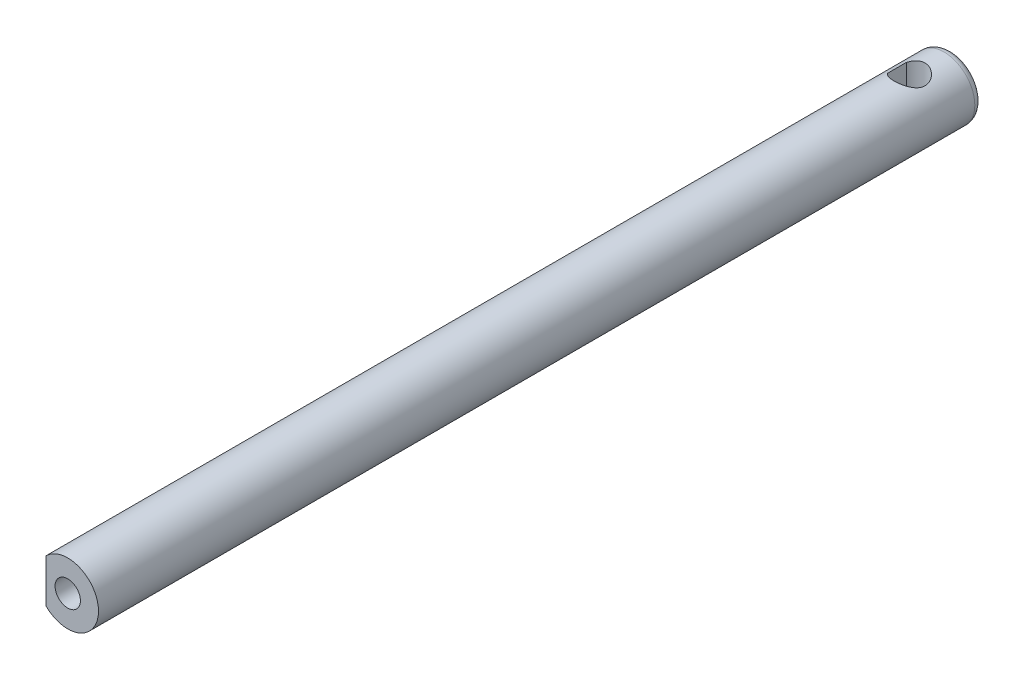
ISO-10303-21;
HEADER;
FILE_DESCRIPTION(('STEP AP214'),'2;1');
FILE_NAME('part.step','',(''),(''),'','','');
FILE_SCHEMA(('AUTOMOTIVE_DESIGN { 1 0 10303 214 1 1 1 1 }'));
ENDSEC;
DATA;
#1=APPLICATION_CONTEXT('core data for automotive mechanical design processes');
#2=APPLICATION_PROTOCOL_DEFINITION('international standard','automotive_design',2000,#1);
#3=PRODUCT_CONTEXT('',#1,'mechanical');
#4=PRODUCT('Part','Part','',(#3));
#5=PRODUCT_RELATED_PRODUCT_CATEGORY('part','',(#4));
#6=PRODUCT_DEFINITION_FORMATION('','',#4);
#7=PRODUCT_DEFINITION_CONTEXT('part definition',#1,'design');
#8=PRODUCT_DEFINITION('design','',#6,#7);
#9=PRODUCT_DEFINITION_SHAPE('','',#8);
#10=(LENGTH_UNIT() NAMED_UNIT(*) SI_UNIT(.MILLI.,.METRE.));
#11=(NAMED_UNIT(*) PLANE_ANGLE_UNIT() SI_UNIT($,.RADIAN.));
#12=(NAMED_UNIT(*) SI_UNIT($,.STERADIAN.) SOLID_ANGLE_UNIT());
#13=UNCERTAINTY_MEASURE_WITH_UNIT(LENGTH_MEASURE(1.E-05),#10,'distance_accuracy_value','');
#14=(GEOMETRIC_REPRESENTATION_CONTEXT(3) GLOBAL_UNCERTAINTY_ASSIGNED_CONTEXT((#13)) GLOBAL_UNIT_ASSIGNED_CONTEXT((#10,
#11,#12)) REPRESENTATION_CONTEXT('',''));
#15=CARTESIAN_POINT('',(0.,0.,0.));
#16=DIRECTION('',(0.,0.,1.));
#17=DIRECTION('',(1.,0.,0.));
#18=AXIS2_PLACEMENT_3D('',#15,#16,#17);
#19=CARTESIAN_POINT('',(-1.625,-4.,-50.7916954026405));
#20=DIRECTION('',(-1.,0.,0.));
#21=DIRECTION('',(0.,0.,1.));
#22=AXIS2_PLACEMENT_3D('',#19,#20,#21);
#23=PLANE('',#22);
#24=CARTESIAN_POINT('',(-1.625,0.,-52.));
#25=DIRECTION('',(1.,0.,0.));
#26=DIRECTION('',(0.,0.,-1.));
#27=AXIS2_PLACEMENT_3D('',#24,#25,#26);
#28=CIRCLE('',#27,1.25);
#29=CARTESIAN_POINT('',(-1.625,0.32015621187165,-53.2083045973595));
#30=VERTEX_POINT('',#29);
#31=CARTESIAN_POINT('',(-1.625,0.32015621187165,-50.7916954026405));
#32=VERTEX_POINT('',#31);
#33=EDGE_CURVE('E122',#30,#32,#28,.T.);
#34=ORIENTED_EDGE('',*,*,#33,.F.);
#35=DIRECTION('',(0.,1.,0.));
#36=VECTOR('',#35,1.);
#37=CARTESIAN_POINT('',(-1.625,-4.,-53.2083045973595));
#38=LINE('',#37,#36);
#39=CARTESIAN_POINT('',(-1.625,3.65504787930336,-53.2083045973594));
#40=VERTEX_POINT('',#39);
#41=EDGE_CURVE('E130',#30,#40,#38,.T.);
#42=ORIENTED_EDGE('',*,*,#41,.T.);
#43=DIRECTION('',(0.,0.,-1.));
#44=VECTOR('',#43,1.);
#45=CARTESIAN_POINT('',(-1.625,3.65504787930336,57.5));
#46=LINE('',#45,#44);
#47=CARTESIAN_POINT('',(-1.625,3.65504787930336,-50.7916954026405));
#48=VERTEX_POINT('',#47);
#49=EDGE_CURVE('E149',#48,#40,#46,.T.);
#50=ORIENTED_EDGE('',*,*,#49,.F.);
#51=DIRECTION('',(0.,1.,0.));
#52=VECTOR('',#51,1.);
#53=CARTESIAN_POINT('',(-1.625,-4.,-50.7916954026405));
#54=LINE('',#53,#52);
#55=EDGE_CURVE('E135',#32,#48,#54,.T.);
#56=ORIENTED_EDGE('',*,*,#55,.F.);
#57=EDGE_LOOP('',(#34,#42,#50,#56));
#58=FACE_BOUND('',#57,.T.);
#59=ADVANCED_FACE('F39',(#58),#23,.F.);
#60=CARTESIAN_POINT('',(-1.625,-0.320156211871648,-50.7916954026405));
#61=VERTEX_POINT('',#60);
#62=CARTESIAN_POINT('',(-1.625,-0.320156211871648,-53.2083045973595));
#63=VERTEX_POINT('',#62);
#64=EDGE_CURVE('E209',#61,#63,#28,.T.);
#65=ORIENTED_EDGE('',*,*,#64,.F.);
#66=CARTESIAN_POINT('',(-1.625,-3.65504787930336,-50.7916954026405));
#67=VERTEX_POINT('',#66);
#68=EDGE_CURVE('E131',#67,#61,#54,.T.);
#69=ORIENTED_EDGE('',*,*,#68,.F.);
#70=DIRECTION('',(0.,0.,-1.));
#71=VECTOR('',#70,1.);
#72=CARTESIAN_POINT('',(-1.625,-3.65504787930336,57.5));
#73=LINE('',#72,#71);
#74=CARTESIAN_POINT('',(-1.625,-3.65504787930336,-53.2083045973595));
#75=VERTEX_POINT('',#74);
#76=EDGE_CURVE('E170',#75,#67,#73,.F.);
#77=ORIENTED_EDGE('',*,*,#76,.F.);
#78=EDGE_CURVE('E136',#75,#63,#38,.T.);
#79=ORIENTED_EDGE('',*,*,#78,.T.);
#80=EDGE_LOOP('',(#65,#69,#77,#79));
#81=FACE_BOUND('',#80,.T.);
#82=ADVANCED_FACE('F188',(#81),#23,.F.);
#83=CARTESIAN_POINT('',(0.,0.,57.5));
#84=DIRECTION('',(0.,0.,-1.));
#85=DIRECTION('',(-1.,0.,0.));
#86=AXIS2_PLACEMENT_3D('',#83,#84,#85);
#87=CYLINDRICAL_SURFACE('',#86,4.);
#88=CARTESIAN_POINT('',(0.,0.,57.5));
#89=DIRECTION('',(0.,0.,1.));
#90=DIRECTION('',(1.,0.,0.));
#91=AXIS2_PLACEMENT_3D('',#88,#89,#90);
#92=CIRCLE('',#91,4.);
#93=CARTESIAN_POINT('',(-2.82842712474619,-2.82842712474619,57.5));
#94=VERTEX_POINT('',#93);
#95=CARTESIAN_POINT('',(-2.82842712474619,2.82842712474619,57.5));
#96=VERTEX_POINT('',#95);
#97=EDGE_CURVE('E116',#94,#96,#92,.T.);
#98=ORIENTED_EDGE('',*,*,#97,.F.);
#99=DIRECTION('',(0.,0.,1.));
#100=VECTOR('',#99,1.);
#101=CARTESIAN_POINT('',(-2.82842712474619,-2.82842712474619,27.5));
#102=LINE('',#101,#100);
#103=CARTESIAN_POINT('',(-2.82842712474619,-2.82842712474619,27.5));
#104=VERTEX_POINT('',#103);
#105=EDGE_CURVE('E59',#104,#94,#102,.T.);
#106=ORIENTED_EDGE('',*,*,#105,.F.);
#107=CARTESIAN_POINT('',(0.,0.,27.5));
#108=DIRECTION('',(0.,0.,1.));
#109=DIRECTION('',(1.,0.,0.));
#110=AXIS2_PLACEMENT_3D('',#107,#108,#109);
#111=CIRCLE('',#110,4.);
#112=CARTESIAN_POINT('',(-2.82842712474619,2.82842712474619,27.5));
#113=VERTEX_POINT('',#112);
#114=EDGE_CURVE('E102',#113,#104,#111,.T.);
#115=ORIENTED_EDGE('',*,*,#114,.F.);
#116=DIRECTION('',(0.,0.,1.));
#117=VECTOR('',#116,1.);
#118=CARTESIAN_POINT('',(-2.82842712474619,2.82842712474619,27.5));
#119=LINE('',#118,#117);
#120=EDGE_CURVE('E110',#113,#96,#119,.T.);
#121=ORIENTED_EDGE('',*,*,#120,.T.);
#122=EDGE_LOOP('',(#98,#106,#115,#121));
#123=FACE_BOUND('',#122,.T.);
#124=CARTESIAN_POINT('',(-4.,0.,-50.75));
#125=CARTESIAN_POINT('',(-3.99999965877989,-0.0684391851745464,-50.7500004465876));
#126=CARTESIAN_POINT('',(-3.99822694984841,-0.136883052502859,-50.7556392269445));
#127=CARTESIAN_POINT('',(-3.99132894088807,-0.271769209588448,-50.7779862415392));
#128=CARTESIAN_POINT('',(-3.9862028819986,-0.338211042725907,-50.7946969813644));
#129=CARTESIAN_POINT('',(-3.97315815697909,-0.467128543650807,-50.8385693711957));
#130=CARTESIAN_POINT('',(-3.96524381499025,-0.529610176985805,-50.865714844653));
#131=CARTESIAN_POINT('',(-3.94743969161093,-0.649134802346461,-50.9296173176783));
#132=CARTESIAN_POINT('',(-3.93754959899905,-0.706176935444885,-50.9663758317806));
#133=CARTESIAN_POINT('',(-3.91650213740282,-0.814965334952279,-51.0496559920174));
#134=CARTESIAN_POINT('',(-3.90531715926989,-0.866520028156658,-51.0964208850611));
#135=CARTESIAN_POINT('',(-3.88310046374209,-0.961197382036992,-51.1978683924136));
#136=CARTESIAN_POINT('',(-3.87206877523457,-1.0043184728987,-51.2525524774946));
#137=CARTESIAN_POINT('',(-3.85111144698172,-1.08194336483114,-51.3699445638081));
#138=CARTESIAN_POINT('',(-3.84121988301796,-1.11620784150129,-51.4328174775272));
#139=CARTESIAN_POINT('',(-3.82407801799234,-1.17359741076672,-51.5637923149819));
#140=CARTESIAN_POINT('',(-3.81682702128689,-1.19672543771944,-51.6318928557939));
#141=CARTESIAN_POINT('',(-3.80607606984501,-1.23048459930033,-51.7692280774521));
#142=CARTESIAN_POINT('',(-3.80246972929508,-1.24147110007864,-51.8383668436389));
#143=CARTESIAN_POINT('',(-3.7991005514095,-1.25174555036988,-51.9775931189119));
#144=CARTESIAN_POINT('',(-3.79933669227334,-1.25103660995772,-52.0476803708217));
#145=CARTESIAN_POINT('',(-3.80353189075438,-1.23821824732739,-52.183874460269));
#146=CARTESIAN_POINT('',(-3.80734341745949,-1.22656057869383,-52.2500291258616));
#147=CARTESIAN_POINT('',(-3.81802025652489,-1.19290813355626,-52.3793921565373));
#148=CARTESIAN_POINT('',(-3.82488589343115,-1.1709122584455,-52.4426002077088));
#149=CARTESIAN_POINT('',(-3.84101044014297,-1.11688874681277,-52.5653519444326));
#150=CARTESIAN_POINT('',(-3.85030284660825,-1.08471925662081,-52.624828610692));
#151=CARTESIAN_POINT('',(-3.8702185658007,-1.01136020737848,-52.7376877678791));
#152=CARTESIAN_POINT('',(-3.88084222394551,-0.970168305215768,-52.7910686702537));
#153=CARTESIAN_POINT('',(-3.90281527800493,-0.87771695418212,-52.892774943417));
#154=CARTESIAN_POINT('',(-3.91417569605696,-0.826084570592814,-52.9407595577797));
#155=CARTESIAN_POINT('',(-3.9359157075958,-0.715364408095527,-53.0274718935797));
#156=CARTESIAN_POINT('',(-3.94629522838372,-0.656276077349016,-53.0661989292192));
#157=CARTESIAN_POINT('',(-3.96501294890191,-0.531664610465449,-53.1335276886013));
#158=CARTESIAN_POINT('',(-3.97333460648208,-0.466094906919274,-53.162048135464));
#159=CARTESIAN_POINT('',(-3.98687955828554,-0.330767977782639,-53.2075530008516));
#160=CARTESIAN_POINT('',(-3.99210379325151,-0.261012030724604,-53.2245409222384));
#161=CARTESIAN_POINT('',(-3.99871389395014,-0.122185157290341,-53.245918042579));
#162=CARTESIAN_POINT('',(-4.00024022895439,-0.0531918487888385,-53.2507685435935));
#163=CARTESIAN_POINT('',(-3.99969799730981,0.0846303057325877,-53.2490337733627));
#164=CARTESIAN_POINT('',(-3.99762995581125,0.153459174306508,-53.2424501726774));
#165=CARTESIAN_POINT('',(-3.99022363769772,0.287219332975854,-53.2184044073936));
#166=CARTESIAN_POINT('',(-3.98496793110725,0.35220497842095,-53.2012167323875));
#167=CARTESIAN_POINT('',(-3.97180121379252,0.478351928861368,-53.1567856476333));
#168=CARTESIAN_POINT('',(-3.96388987514204,0.539512760449018,-53.1295409959751));
#169=CARTESIAN_POINT('',(-3.94598542759568,0.657932406672232,-53.0650267834512));
#170=CARTESIAN_POINT('',(-3.9359462681821,0.715059739787954,-53.0275290125028));
#171=CARTESIAN_POINT('',(-3.91493410002887,0.822365850960094,-52.943846789883));
#172=CARTESIAN_POINT('',(-3.90396083845862,0.872542738043336,-52.8976599822569));
#173=CARTESIAN_POINT('',(-3.88176994885247,0.966587462919658,-52.7957411099463));
#174=CARTESIAN_POINT('',(-3.87055986714446,1.01012652339774,-52.7397033362547));
#175=CARTESIAN_POINT('',(-3.84961947087602,1.08721250244909,-52.6208733836293));
#176=CARTESIAN_POINT('',(-3.839889132814,1.12075957972524,-52.5580813119956));
#177=CARTESIAN_POINT('',(-3.82311782360754,1.17670083481141,-52.4276548271141));
#178=CARTESIAN_POINT('',(-3.81606646468027,1.19913819558886,-52.3600403504953));
#179=CARTESIAN_POINT('',(-3.80551170941212,1.23222894320964,-52.2217275066762));
#180=CARTESIAN_POINT('',(-3.80200696302675,1.2428868141461,-52.1510303236287));
#181=CARTESIAN_POINT('',(-3.79908292712494,1.2517940615754,-52.0119959124458));
#182=CARTESIAN_POINT('',(-3.79948604683077,1.25058279621957,-51.9436965461871));
#183=CARTESIAN_POINT('',(-3.80390090472383,1.23708818129474,-51.8083254150808));
#184=CARTESIAN_POINT('',(-3.80791247457319,1.22480534822559,-51.741253593116));
#185=CARTESIAN_POINT('',(-3.81896814158112,1.18987729913378,-51.6112059603982));
#186=CARTESIAN_POINT('',(-3.82596698183474,1.16738642405944,-51.548184558904));
#187=CARTESIAN_POINT('',(-3.84219704261348,1.11280227335064,-51.4267595864686));
#188=CARTESIAN_POINT('',(-3.85142871716522,1.08070704444254,-51.3683569579223));
#189=CARTESIAN_POINT('',(-3.8715348703158,1.00635675013475,-51.2553540295594));
#190=CARTESIAN_POINT('',(-3.88245948922441,0.963753335241271,-51.2009918704996));
#191=CARTESIAN_POINT('',(-3.90448998821726,0.870208996404846,-51.1000136718882));
#192=CARTESIAN_POINT('',(-3.91559591606795,0.8192658423444,-51.053399711009));
#193=CARTESIAN_POINT('',(-3.93717271952329,0.70848666282333,-50.967717461637));
#194=CARTESIAN_POINT('',(-3.94761101730634,0.64841457448738,-50.92894526355));
#195=CARTESIAN_POINT('',(-3.96626769296916,0.522279138013654,-50.8621010848606));
#196=CARTESIAN_POINT('',(-3.97448694315832,0.456218157795448,-50.8340248978582));
#197=CARTESIAN_POINT('',(-3.98720650733461,0.325747635373976,-50.7914086323915));
#198=CARTESIAN_POINT('',(-3.99196240806139,0.261670337112545,-50.7759251326947));
#199=CARTESIAN_POINT('',(-3.99835900340486,0.131729895440247,-50.7552216400323));
#200=CARTESIAN_POINT('',(-4.00000032839644,0.0658671161396744,-50.749999570196));
#201=CARTESIAN_POINT('',(-4.,0.,-50.75));
#202=B_SPLINE_CURVE_WITH_KNOTS('',3,(#124,#125,#126,#127,#128,#129,#130,#131,#132,#133,#134,
#135,#136,#137,#138,#139,#140,#141,#142,#143,#144,#145,#146,#147,#148,#149,#150,#151,#152,#153,
#154,#155,#156,#157,#158,#159,#160,#161,#162,#163,#164,#165,#166,#167,#168,#169,#170,#171,#172,
#173,#174,#175,#176,#177,#178,#179,#180,#181,#182,#183,#184,#185,#186,#187,#188,#189,#190,#191,
#192,#193,#194,#195,#196,#197,#198,#199,#200,#201),.UNSPECIFIED.,.T.,.F.,(4,2,2,2,2,2,2,2,2,2,2,
2,2,2,2,2,2,2,2,2,2,2,2,2,2,2,2,2,2,2,2,2,2,2,2,2,2,2,4),(0.,0.20507544943251,0.410197323349066,
0.615002479202437,0.819839921558393,1.03037822195158,1.24095567431276,1.45673771247494,
1.67246286279527,1.8816915016721,2.09086450295138,2.29176917422169,2.49269519979063,
2.69655642720545,2.90047066010358,3.113667472796,3.32688007413303,3.5417546068977,
3.75656384494553,3.96307568548237,4.16955735649362,4.37090626722871,4.57228005034499,
4.77856324738342,4.98490245709259,5.19941778713139,5.41392970983711,5.6276011575103,
5.8411912389243,6.04512203476051,6.24904331751084,6.44997913396671,6.65095584330173,
6.85979514006361,7.0686903737334,7.28440668126411,7.50003806666336,7.6974463665154,
7.89481470763047),.UNSPECIFIED.);
#203=CARTESIAN_POINT('',(-4.,0.,-50.75));
#204=VERTEX_POINT('',#203);
#205=EDGE_CURVE('E43',#204,#204,#202,.T.);
#206=ORIENTED_EDGE('',*,*,#205,.T.);
#207=EDGE_LOOP('',(#206));
#208=FACE_BOUND('',#207,.T.);
#209=CARTESIAN_POINT('',(0.,0.,-56.5));
#210=DIRECTION('',(0.,0.,1.));
#211=DIRECTION('',(1.,0.,0.));
#212=AXIS2_PLACEMENT_3D('',#209,#210,#211);
#213=CIRCLE('',#212,4.);
#214=CARTESIAN_POINT('',(4.,0.,-56.5));
#215=VERTEX_POINT('',#214);
#216=EDGE_CURVE('E52',#215,#215,#213,.T.);
#217=ORIENTED_EDGE('',*,*,#216,.T.);
#218=EDGE_LOOP('',(#217));
#219=FACE_BOUND('',#218,.T.);
#220=ORIENTED_EDGE('',*,*,#76,.T.);
#221=CARTESIAN_POINT('',(-1.625,-3.65504787930336,-50.7916954026405));
#222=CARTESIAN_POINT('',(-1.59065445612944,-3.67031734470369,-50.7455152045182));
#223=CARTESIAN_POINT('',(-1.55440967165005,-3.68585127502512,-50.7008747828288));
#224=CARTESIAN_POINT('',(-1.47827447239932,-3.71704186776497,-50.614851221228));
#225=CARTESIAN_POINT('',(-1.43838345275373,-3.73269855015144,-50.5734686238844));
#226=CARTESIAN_POINT('',(-1.31322489248811,-3.77933360307732,-50.4542454433797));
#227=CARTESIAN_POINT('',(-1.22269130833008,-3.80987509111564,-50.381624351748));
#228=CARTESIAN_POINT('',(-1.02940806732404,-3.86658558077105,-50.2522876400656));
#229=CARTESIAN_POINT('',(-0.926634909000756,-3.89274593067169,-50.1956033451072));
#230=CARTESIAN_POINT('',(-0.71161244190676,-3.93771675126236,-50.1005276240621));
#231=CARTESIAN_POINT('',(-0.599382892972895,-3.95654210741472,-50.06209911498));
#232=CARTESIAN_POINT('',(-0.376527432987999,-3.98371349584548,-50.0072314830343));
#233=CARTESIAN_POINT('',(-0.266298577811468,-3.99267755082228,-49.9894906984952));
#234=CARTESIAN_POINT('',(-0.0440388428634993,-4.00130085113213,-49.9724168448269));
#235=CARTESIAN_POINT('',(0.0679918316189629,-4.00096114908087,-49.9730816933069));
#236=CARTESIAN_POINT('',(0.280914773949715,-3.99143157270792,-49.991965567625));
#237=CARTESIAN_POINT('',(0.381971644568361,-3.98296404299024,-50.0087518935336));
#238=CARTESIAN_POINT('',(0.579607442767016,-3.95903606148,-50.0570562378454));
#239=CARTESIAN_POINT('',(0.676186341947693,-3.94357556534466,-50.0885743496636));
#240=CARTESIAN_POINT('',(0.864939934741276,-3.9065795753516,-50.1661037275185));
#241=CARTESIAN_POINT('',(0.956946867887506,-3.88490342964291,-50.2124538227921));
#242=CARTESIAN_POINT('',(1.13215815242522,-3.83750812541062,-50.3179438623132));
#243=CARTESIAN_POINT('',(1.21535873485578,-3.81178724742596,-50.3770892500189));
#244=CARTESIAN_POINT('',(1.37937437483765,-3.75573724389656,-50.5132545353679));
#245=CARTESIAN_POINT('',(1.45913171324096,-3.72520415142212,-50.5914663112538));
#246=CARTESIAN_POINT('',(1.60490321311478,-3.66476810918415,-50.7601020800912));
#247=CARTESIAN_POINT('',(1.67090703447578,-3.63486564861077,-50.8505351776224));
#248=CARTESIAN_POINT('',(1.79080215117162,-3.57738663661952,-51.047297559802));
#249=CARTESIAN_POINT('',(1.84381890726663,-3.55003098571156,-51.1542302203398));
#250=CARTESIAN_POINT('',(1.93057968887192,-3.50361453798794,-51.377295967397));
#251=CARTESIAN_POINT('',(1.96434806022712,-3.48454327017538,-51.493417219181));
#252=CARTESIAN_POINT('',(2.00856478076869,-3.45922862340765,-51.720077628371));
#253=CARTESIAN_POINT('',(2.02088834518467,-3.45195800657709,-51.8301329818369));
#254=CARTESIAN_POINT('',(2.02736510595728,-3.44816112168606,-52.0509384110744));
#255=CARTESIAN_POINT('',(2.02152807299321,-3.45162907610515,-52.1616880812938));
#256=CARTESIAN_POINT('',(1.99362044449181,-3.46780671252403,-52.368601276668));
#257=CARTESIAN_POINT('',(1.97329217765352,-3.47952293899052,-52.4650882678628));
#258=CARTESIAN_POINT('',(1.91927214963839,-3.50960740432374,-52.6531438016479));
#259=CARTESIAN_POINT('',(1.88557600520968,-3.52797782489132,-52.7447107197808));
#260=CARTESIAN_POINT('',(1.80346377761275,-3.5706834586428,-52.9266726565608));
#261=CARTESIAN_POINT('',(1.75426269667085,-3.59531853371833,-53.0166407846926));
#262=CARTESIAN_POINT('',(1.64334131967624,-3.64735272404418,-53.1876248436483));
#263=CARTESIAN_POINT('',(1.58161397554043,-3.6747533910127,-53.2686356947106));
#264=CARTESIAN_POINT('',(1.43820600210228,-3.73340228776455,-53.430133044583));
#265=CARTESIAN_POINT('',(1.35498633458512,-3.76469679539487,-53.5092434993622));
#266=CARTESIAN_POINT('',(1.17573100332423,-3.8244711273565,-53.6527131345918));
#267=CARTESIAN_POINT('',(1.07969226351611,-3.85295027324967,-53.7170687643701));
#268=CARTESIAN_POINT('',(0.875397100518827,-3.90447373527331,-53.8297788245509));
#269=CARTESIAN_POINT('',(0.766989771367275,-3.92743724218747,-53.8778990823701));
#270=CARTESIAN_POINT('',(0.542114900453844,-3.96472627888491,-53.9546907752264));
#271=CARTESIAN_POINT('',(0.425654919162699,-3.97905979165363,-53.9833801874163));
#272=CARTESIAN_POINT('',(0.200332865227882,-3.99641958249447,-54.0179664794107));
#273=CARTESIAN_POINT('',(0.0918443153471417,-4.00041610742462,-54.0258210839526));
#274=CARTESIAN_POINT('',(-0.124932603220498,-3.99951546570021,-54.0240437498785));
#275=CARTESIAN_POINT('',(-0.233221026606245,-3.99462126497835,-54.0144176428021));
#276=CARTESIAN_POINT('',(-0.439829831640005,-3.97701844799435,-53.9792700769727));
#277=CARTESIAN_POINT('',(-0.538360783187728,-3.96478967468403,-53.954723515632));
#278=CARTESIAN_POINT('',(-0.7297960050695,-3.93405697314025,-53.8916095905763));
#279=CARTESIAN_POINT('',(-0.82269808423785,-3.91555061948034,-53.853036807229));
#280=CARTESIAN_POINT('',(-1.00558510469183,-3.87273573150772,-53.7608127544991));
#281=CARTESIAN_POINT('',(-1.09516480393114,-3.84817480417127,-53.7064796468754));
#282=CARTESIAN_POINT('',(-1.26430507444834,-3.79596686730626,-53.5852375186442));
#283=CARTESIAN_POINT('',(-1.34386957487924,-3.7683210761092,-53.5183334557019));
#284=CARTESIAN_POINT('',(-1.45535422060355,-3.72606603128251,-53.4090234645067));
#285=CARTESIAN_POINT('',(-1.49148558699099,-3.71172102185698,-53.370719153172));
#286=CARTESIAN_POINT('',(-1.56060410141104,-3.68319267250016,-53.2914695268223));
#287=CARTESIAN_POINT('',(-1.59359776503942,-3.66900905388925,-53.250529994365));
#288=CARTESIAN_POINT('',(-1.625,-3.65504787930336,-53.2083045973595));
#289=B_SPLINE_CURVE_WITH_KNOTS('',3,(#221,#222,#223,#224,#225,#226,#227,#228,#229,#230,#231,
#232,#233,#234,#235,#236,#237,#238,#239,#240,#241,#242,#243,#244,#245,#246,#247,#248,#249,#250,
#251,#252,#253,#254,#255,#256,#257,#258,#259,#260,#261,#262,#263,#264,#265,#266,#267,#268,#269,
#270,#271,#272,#273,#274,#275,#276,#277,#278,#279,#280,#281,#282,#283,#284,#285,#286,#287,#288),
.UNSPECIFIED.,.F.,.F.,(4,2,2,2,2,2,2,2,2,2,2,2,2,2,2,2,2,2,2,2,2,2,2,2,2,2,2,2,2,2,2,2,2,4),(0.,
0.178518153741011,0.357065975808178,0.71529219830167,1.07421769836808,1.43241096179007,
1.76658659090602,2.10072441195644,2.40767505590901,2.71462764627902,3.02916379777508,
3.34383402539868,3.68975829498086,4.03594170491171,4.40132022880652,4.76623558133071,
5.09724558647236,5.42807753396781,5.72467544580932,6.02137069092546,6.33651425341562,
6.65183563011127,7.00724504896284,7.36273990568897,7.7231625861205,8.08325135122725,
8.40806002256052,8.73276035810798,9.03823544979647,9.34382870052374,9.66536965892136,
9.9867840748924,10.1503769712733,10.3136223811266),.UNSPECIFIED.);
#290=EDGE_CURVE('E163',#67,#75,#289,.T.);
#291=ORIENTED_EDGE('',*,*,#290,.T.);
#292=EDGE_LOOP('',(#220,#291));
#293=FACE_BOUND('',#292,.T.);
#294=ORIENTED_EDGE('',*,*,#49,.T.);
#295=CARTESIAN_POINT('',(-1.625,3.65504787930336,-53.2083045973595));
#296=CARTESIAN_POINT('',(-1.59065445612944,3.67031734470369,-53.2544847954818));
#297=CARTESIAN_POINT('',(-1.55440967165005,3.68585127502513,-53.2991252171712));
#298=CARTESIAN_POINT('',(-1.47827447239932,3.71704186776497,-53.385148778772));
#299=CARTESIAN_POINT('',(-1.43838345275373,3.73269855015144,-53.4265313761156));
#300=CARTESIAN_POINT('',(-1.31322489248811,3.77933360307732,-53.5457545566203));
#301=CARTESIAN_POINT('',(-1.22269130833008,3.80987509111564,-53.618375648252));
#302=CARTESIAN_POINT('',(-1.02940806732404,3.86658558077105,-53.7477123599343));
#303=CARTESIAN_POINT('',(-0.926634909000756,3.89274593067169,-53.8043966548928));
#304=CARTESIAN_POINT('',(-0.71161244190676,3.93771675126236,-53.8994723759379));
#305=CARTESIAN_POINT('',(-0.599382892972895,3.95654210741472,-53.93790088502));
#306=CARTESIAN_POINT('',(-0.376527432987999,3.98371349584548,-53.9927685169657));
#307=CARTESIAN_POINT('',(-0.266298577811468,3.99267755082228,-54.0105093015048));
#308=CARTESIAN_POINT('',(-0.0440388428634993,4.00130085113213,-54.0275831551731));
#309=CARTESIAN_POINT('',(0.0679918316189629,4.00096114908087,-54.0269183066931));
#310=CARTESIAN_POINT('',(0.280914773949715,3.99143157270792,-54.008034432375));
#311=CARTESIAN_POINT('',(0.381971644568361,3.98296404299024,-53.9912481064664));
#312=CARTESIAN_POINT('',(0.579607442767016,3.95903606148,-53.9429437621546));
#313=CARTESIAN_POINT('',(0.676186341947693,3.94357556534466,-53.9114256503364));
#314=CARTESIAN_POINT('',(0.864939934741276,3.9065795753516,-53.8338962724814));
#315=CARTESIAN_POINT('',(0.956946867887506,3.88490342964291,-53.7875461772079));
#316=CARTESIAN_POINT('',(1.13215815242522,3.83750812541062,-53.6820561376868));
#317=CARTESIAN_POINT('',(1.21535873485578,3.81178724742596,-53.6229107499811));
#318=CARTESIAN_POINT('',(1.37937437483765,3.75573724389656,-53.4867454646321));
#319=CARTESIAN_POINT('',(1.45913171324096,3.72520415142212,-53.4085336887462));
#320=CARTESIAN_POINT('',(1.60490321311478,3.66476810918415,-53.2398979199088));
#321=CARTESIAN_POINT('',(1.67090703447578,3.63486564861077,-53.1494648223776));
#322=CARTESIAN_POINT('',(1.79080215117162,3.57738663661952,-52.952702440198));
#323=CARTESIAN_POINT('',(1.84381890726663,3.55003098571156,-52.8457697796602));
#324=CARTESIAN_POINT('',(1.93057968887193,3.50361453798794,-52.622704032603));
#325=CARTESIAN_POINT('',(1.96434806022712,3.48454327017538,-52.506582780819));
#326=CARTESIAN_POINT('',(2.00856478076869,3.45922862340765,-52.2799223716289));
#327=CARTESIAN_POINT('',(2.02088834518467,3.4519580065771,-52.1698670181631));
#328=CARTESIAN_POINT('',(2.02736510595729,3.44816112168606,-51.9490615889256));
#329=CARTESIAN_POINT('',(2.02152807299321,3.45162907610515,-51.8383119187062));
#330=CARTESIAN_POINT('',(1.99362044449181,3.46780671252403,-51.631398723332));
#331=CARTESIAN_POINT('',(1.97329217765352,3.47952293899052,-51.5349117321372));
#332=CARTESIAN_POINT('',(1.91927214963838,3.50960740432374,-51.3468561983521));
#333=CARTESIAN_POINT('',(1.88557600520968,3.52797782489132,-51.2552892802192));
#334=CARTESIAN_POINT('',(1.80346377761275,3.5706834586428,-51.0733273434392));
#335=CARTESIAN_POINT('',(1.75426269667085,3.59531853371833,-50.9833592153074));
#336=CARTESIAN_POINT('',(1.64334131967624,3.64735272404418,-50.8123751563517));
#337=CARTESIAN_POINT('',(1.58161397554043,3.6747533910127,-50.7313643052894));
#338=CARTESIAN_POINT('',(1.43820600210228,3.73340228776455,-50.5698669554169));
#339=CARTESIAN_POINT('',(1.35498633458512,3.76469679539487,-50.4907565006378));
#340=CARTESIAN_POINT('',(1.17573100332423,3.8244711273565,-50.3472868654082));
#341=CARTESIAN_POINT('',(1.07969226351611,3.85295027324967,-50.2829312356299));
#342=CARTESIAN_POINT('',(0.875397100518827,3.90447373527331,-50.1702211754491));
#343=CARTESIAN_POINT('',(0.766989771367275,3.92743724218747,-50.1221009176299));
#344=CARTESIAN_POINT('',(0.542114900453844,3.96472627888491,-50.0453092247736));
#345=CARTESIAN_POINT('',(0.425654919162699,3.97905979165363,-50.0166198125837));
#346=CARTESIAN_POINT('',(0.200332865227882,3.99641958249447,-49.9820335205893));
#347=CARTESIAN_POINT('',(0.0918443153471417,4.00041610742462,-49.9741789160474));
#348=CARTESIAN_POINT('',(-0.124932603220498,3.99951546570021,-49.9759562501215));
#349=CARTESIAN_POINT('',(-0.233221026606245,3.99462126497835,-49.9855823571979));
#350=CARTESIAN_POINT('',(-0.439829831640005,3.97701844799435,-50.0207299230273));
#351=CARTESIAN_POINT('',(-0.538360783187728,3.96478967468403,-50.045276484368));
#352=CARTESIAN_POINT('',(-0.7297960050695,3.93405697314025,-50.1083904094237));
#353=CARTESIAN_POINT('',(-0.82269808423785,3.91555061948034,-50.1469631927709));
#354=CARTESIAN_POINT('',(-1.00558510469183,3.87273573150772,-50.2391872455009));
#355=CARTESIAN_POINT('',(-1.09516480393114,3.84817480417127,-50.2935203531246));
#356=CARTESIAN_POINT('',(-1.26430507444834,3.79596686730626,-50.4147624813558));
#357=CARTESIAN_POINT('',(-1.34386957487924,3.7683210761092,-50.4816665442981));
#358=CARTESIAN_POINT('',(-1.45535422060355,3.72606603128251,-50.5909765354933));
#359=CARTESIAN_POINT('',(-1.49148558699099,3.71172102185698,-50.629280846828));
#360=CARTESIAN_POINT('',(-1.56060410141104,3.68319267250016,-50.7085304731777));
#361=CARTESIAN_POINT('',(-1.59359776503942,3.66900905388925,-50.749470005635));
#362=CARTESIAN_POINT('',(-1.625,3.65504787930336,-50.7916954026405));
#363=B_SPLINE_CURVE_WITH_KNOTS('',3,(#295,#296,#297,#298,#299,#300,#301,#302,#303,#304,#305,
#306,#307,#308,#309,#310,#311,#312,#313,#314,#315,#316,#317,#318,#319,#320,#321,#322,#323,#324,
#325,#326,#327,#328,#329,#330,#331,#332,#333,#334,#335,#336,#337,#338,#339,#340,#341,#342,#343,
#344,#345,#346,#347,#348,#349,#350,#351,#352,#353,#354,#355,#356,#357,#358,#359,#360,#361,#362),
.UNSPECIFIED.,.F.,.F.,(4,2,2,2,2,2,2,2,2,2,2,2,2,2,2,2,2,2,2,2,2,2,2,2,2,2,2,2,2,2,2,2,2,4),(0.,
0.178518153741011,0.357065975808177,0.715292198301669,1.07421769836808,1.43241096179007,
1.76658659090602,2.10072441195644,2.40767505590901,2.71462764627902,3.02916379777508,
3.34383402539868,3.68975829498086,4.03594170491171,4.40132022880652,4.76623558133071,
5.09724558647235,5.42807753396781,5.72467544580935,6.02137069092546,6.33651425341562,
6.65183563011127,7.00724504896284,7.36273990568897,7.7231625861205,8.08325135122725,
8.40806002256052,8.73276035810798,9.03823544979647,9.34382870052374,9.66536965892136,
9.9867840748924,10.1503769712733,10.3136223811266),.UNSPECIFIED.);
#364=EDGE_CURVE('E141',#40,#48,#363,.T.);
#365=ORIENTED_EDGE('',*,*,#364,.T.);
#366=EDGE_LOOP('',(#294,#365));
#367=FACE_BOUND('',#366,.T.);
#368=ADVANCED_FACE('F113',(#123,#208,#219,#293,#367),#87,.T.);
#369=CARTESIAN_POINT('',(0.,0.,57.5));
#370=DIRECTION('',(0.,0.,1.));
#371=DIRECTION('',(1.,0.,0.));
#372=AXIS2_PLACEMENT_3D('',#369,#370,#371);
#373=PLANE('',#372);
#374=DIRECTION('',(0.,1.,0.));
#375=VECTOR('',#374,1.);
#376=CARTESIAN_POINT('',(-2.82842712474619,0.,57.5));
#377=LINE('',#376,#375);
#378=EDGE_CURVE('E107',#94,#96,#377,.T.);
#379=ORIENTED_EDGE('',*,*,#378,.F.);
#380=ORIENTED_EDGE('',*,*,#97,.T.);
#381=EDGE_LOOP('',(#379,#380));
#382=FACE_BOUND('',#381,.T.);
#383=CARTESIAN_POINT('',(0.,0.,57.5));
#384=DIRECTION('',(0.,0.,1.));
#385=DIRECTION('',(1.,0.,0.));
#386=AXIS2_PLACEMENT_3D('',#383,#384,#385);
#387=CIRCLE('',#386,1.65);
#388=CARTESIAN_POINT('',(1.65,0.,57.5));
#389=VERTEX_POINT('',#388);
#390=EDGE_CURVE('E124',#389,#389,#387,.T.);
#391=ORIENTED_EDGE('',*,*,#390,.F.);
#392=EDGE_LOOP('',(#391));
#393=FACE_BOUND('',#392,.T.);
#394=ADVANCED_FACE('F161',(#382,#393),#373,.T.);
#395=CARTESIAN_POINT('',(0.,0.,-57.5));
#396=DIRECTION('',(0.,0.,1.));
#397=DIRECTION('',(1.,0.,0.));
#398=AXIS2_PLACEMENT_3D('',#395,#396,#397);
#399=PLANE('',#398);
#400=CARTESIAN_POINT('',(0.,0.,-57.5));
#401=DIRECTION('',(0.,0.,1.));
#402=DIRECTION('',(1.,0.,0.));
#403=AXIS2_PLACEMENT_3D('',#400,#401,#402);
#404=CIRCLE('',#403,3.);
#405=CARTESIAN_POINT('',(3.,0.,-57.5));
#406=VERTEX_POINT('',#405);
#407=EDGE_CURVE('E11',#406,#406,#404,.F.);
#408=ORIENTED_EDGE('',*,*,#407,.T.);
#409=EDGE_LOOP('',(#408));
#410=FACE_BOUND('',#409,.T.);
#411=ADVANCED_FACE('F158',(#410),#399,.F.);
#412=CARTESIAN_POINT('',(0.,-4.,-52.));
#413=DIRECTION('',(0.,1.,0.));
#414=DIRECTION('',(0.,0.,1.));
#415=AXIS2_PLACEMENT_3D('',#412,#413,#414);
#416=CYLINDRICAL_SURFACE('',#415,2.025);
#417=ORIENTED_EDGE('',*,*,#78,.F.);
#418=ORIENTED_EDGE('',*,*,#290,.F.);
#419=ORIENTED_EDGE('',*,*,#68,.T.);
#420=EDGE_CURVE('E134',#61,#32,#54,.T.);
#421=ORIENTED_EDGE('',*,*,#420,.T.);
#422=ORIENTED_EDGE('',*,*,#55,.T.);
#423=ORIENTED_EDGE('',*,*,#364,.F.);
#424=ORIENTED_EDGE('',*,*,#41,.F.);
#425=EDGE_CURVE('E139',#63,#30,#38,.T.);
#426=ORIENTED_EDGE('',*,*,#425,.F.);
#427=EDGE_LOOP('',(#417,#418,#419,#421,#422,#423,#424,#426));
#428=FACE_BOUND('',#427,.T.);
#429=ADVANCED_FACE('F153',(#428),#416,.F.);
#430=CARTESIAN_POINT('',(0.,0.,-56.5));
#431=DIRECTION('',(0.,0.,1.));
#432=DIRECTION('',(1.,0.,0.));
#433=AXIS2_PLACEMENT_3D('',#430,#431,#432);
#434=TOROIDAL_SURFACE('',#433,3.,1.);
#435=ORIENTED_EDGE('',*,*,#407,.F.);
#436=EDGE_LOOP('',(#435));
#437=FACE_BOUND('',#436,.T.);
#438=ORIENTED_EDGE('',*,*,#216,.F.);
#439=EDGE_LOOP('',(#438));
#440=FACE_BOUND('',#439,.T.);
#441=ADVANCED_FACE('F41',(#437,#440),#434,.T.);
#442=CARTESIAN_POINT('',(0.,0.,47.5));
#443=DIRECTION('',(0.,0.,1.));
#444=DIRECTION('',(1.,0.,0.));
#445=AXIS2_PLACEMENT_3D('',#442,#443,#444);
#446=CONICAL_SURFACE('',#445,1.65,1.02974425867665);
#447=CARTESIAN_POINT('',(0.,0.,46.5085799786045));
#448=VERTEX_POINT('',#447);
#449=VERTEX_LOOP('',#448);
#450=FACE_BOUND('',#449,.T.);
#451=CARTESIAN_POINT('',(0.,0.,47.5));
#452=DIRECTION('',(0.,0.,1.));
#453=DIRECTION('',(1.,0.,0.));
#454=AXIS2_PLACEMENT_3D('',#451,#452,#453);
#455=CIRCLE('',#454,1.65);
#456=CARTESIAN_POINT('',(1.65,0.,47.5));
#457=VERTEX_POINT('',#456);
#458=EDGE_CURVE('E127',#457,#457,#455,.T.);
#459=ORIENTED_EDGE('',*,*,#458,.T.);
#460=EDGE_LOOP('',(#459));
#461=FACE_BOUND('',#460,.T.);
#462=ADVANCED_FACE('F179',(#450,#461),#446,.F.);
#463=CARTESIAN_POINT('',(0.,0.,57.5));
#464=DIRECTION('',(0.,0.,1.));
#465=DIRECTION('',(1.,0.,0.));
#466=AXIS2_PLACEMENT_3D('',#463,#464,#465);
#467=CYLINDRICAL_SURFACE('',#466,1.65);
#468=ORIENTED_EDGE('',*,*,#458,.F.);
#469=EDGE_LOOP('',(#468));
#470=FACE_BOUND('',#469,.T.);
#471=ORIENTED_EDGE('',*,*,#390,.T.);
#472=EDGE_LOOP('',(#471));
#473=FACE_BOUND('',#472,.T.);
#474=ADVANCED_FACE('F184',(#470,#473),#467,.F.);
#475=CARTESIAN_POINT('',(-1.625,1.25,-52.));
#476=DIRECTION('',(1.,0.,0.));
#477=DIRECTION('',(0.,0.,-1.));
#478=AXIS2_PLACEMENT_3D('',#475,#476,#477);
#479=PLANE('',#478);
#480=EDGE_CURVE('E67',#32,#61,#28,.T.);
#481=ORIENTED_EDGE('',*,*,#480,.F.);
#482=ORIENTED_EDGE('',*,*,#420,.F.);
#483=EDGE_LOOP('',(#481,#482));
#484=FACE_BOUND('',#483,.T.);
#485=ADVANCED_FACE('F225',(#484),#479,.F.);
#486=CARTESIAN_POINT('',(-1.625,0.,-52.));
#487=DIRECTION('',(1.,0.,0.));
#488=DIRECTION('',(0.,0.,-1.));
#489=AXIS2_PLACEMENT_3D('',#486,#487,#488);
#490=CYLINDRICAL_SURFACE('',#489,1.25);
#491=ORIENTED_EDGE('',*,*,#33,.T.);
#492=ORIENTED_EDGE('',*,*,#480,.T.);
#493=ORIENTED_EDGE('',*,*,#64,.T.);
#494=EDGE_CURVE('E118',#63,#30,#28,.T.);
#495=ORIENTED_EDGE('',*,*,#494,.T.);
#496=EDGE_LOOP('',(#491,#492,#493,#495));
#497=FACE_BOUND('',#496,.T.);
#498=ORIENTED_EDGE('',*,*,#205,.F.);
#499=EDGE_LOOP('',(#498));
#500=FACE_BOUND('',#499,.T.);
#501=ADVANCED_FACE('F206',(#497,#500),#490,.F.);
#502=ORIENTED_EDGE('',*,*,#425,.T.);
#503=ORIENTED_EDGE('',*,*,#494,.F.);
#504=EDGE_LOOP('',(#502,#503));
#505=FACE_BOUND('',#504,.T.);
#506=ADVANCED_FACE('F205',(#505),#479,.F.);
#507=CARTESIAN_POINT('',(-2.82842712474619,0.,27.5));
#508=DIRECTION('',(1.,0.,0.));
#509=DIRECTION('',(0.,0.,-1.));
#510=AXIS2_PLACEMENT_3D('',#507,#508,#509);
#511=PLANE('',#510);
#512=ORIENTED_EDGE('',*,*,#378,.T.);
#513=ORIENTED_EDGE('',*,*,#120,.F.);
#514=DIRECTION('',(0.,1.,0.));
#515=VECTOR('',#514,1.);
#516=CARTESIAN_POINT('',(-2.82842712474619,0.,27.5));
#517=LINE('',#516,#515);
#518=EDGE_CURVE('E104',#104,#113,#517,.T.);
#519=ORIENTED_EDGE('',*,*,#518,.F.);
#520=ORIENTED_EDGE('',*,*,#105,.T.);
#521=EDGE_LOOP('',(#512,#513,#519,#520));
#522=FACE_BOUND('',#521,.T.);
#523=ADVANCED_FACE('F109',(#522),#511,.F.);
#524=CARTESIAN_POINT('',(0.,0.,27.5));
#525=DIRECTION('',(0.,0.,1.));
#526=DIRECTION('',(1.,0.,0.));
#527=AXIS2_PLACEMENT_3D('',#524,#525,#526);
#528=PLANE('',#527);
#529=ORIENTED_EDGE('',*,*,#114,.T.);
#530=ORIENTED_EDGE('',*,*,#518,.T.);
#531=EDGE_LOOP('',(#529,#530));
#532=FACE_BOUND('',#531,.T.);
#533=ADVANCED_FACE('F103',(#532),#528,.T.);
#534=CLOSED_SHELL('',(#59,#82,#368,#394,#411,#429,#441,#462,#474,#485,#501,#506,#523,#533));
#535=MANIFOLD_SOLID_BREP('B2',#534);
#536=ADVANCED_BREP_SHAPE_REPRESENTATION('',(#18,#535),#14);
#537=SHAPE_DEFINITION_REPRESENTATION(#9,#536);
ENDSEC;
END-ISO-10303-21;
